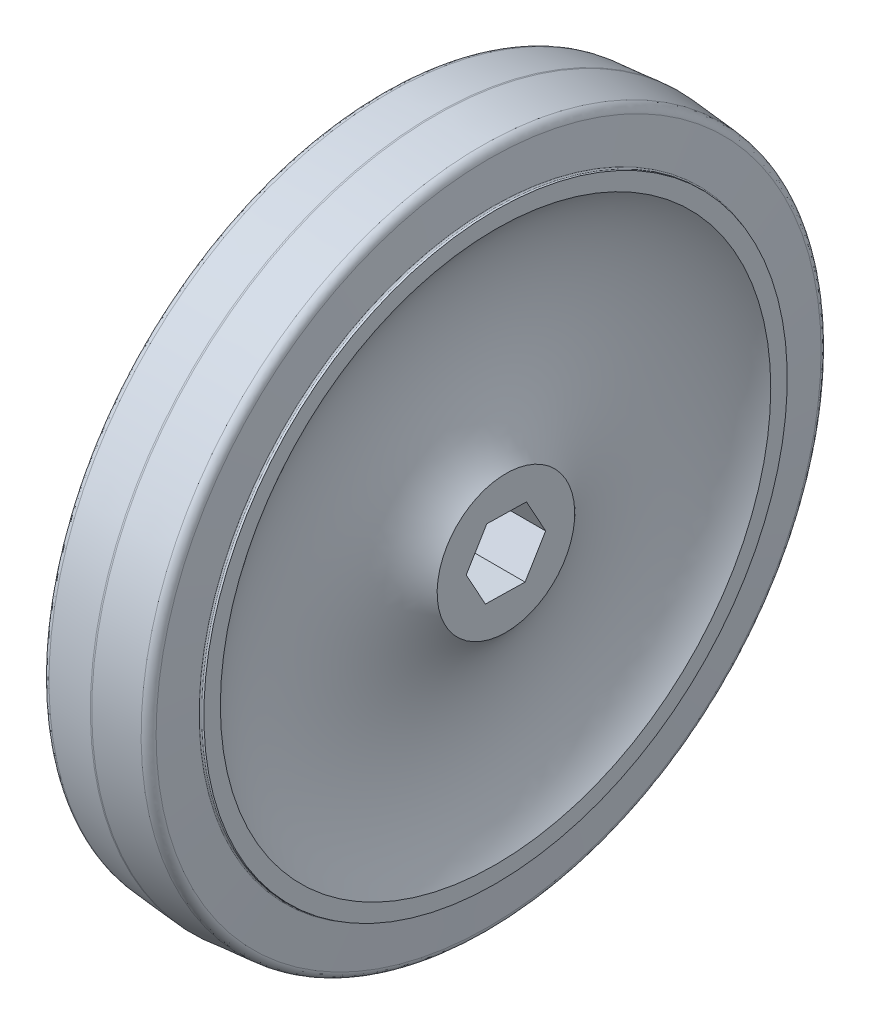
ISO-10303-21;
HEADER;
FILE_DESCRIPTION(('STEP AP214'),'2;1');
FILE_NAME('part.step','',(''),(''),'','','');
FILE_SCHEMA(('AUTOMOTIVE_DESIGN { 1 0 10303 214 1 1 1 1 }'));
ENDSEC;
DATA;
#1=APPLICATION_CONTEXT('core data for automotive mechanical design processes');
#2=APPLICATION_PROTOCOL_DEFINITION('international standard','automotive_design',2000,#1);
#3=PRODUCT_CONTEXT('',#1,'mechanical');
#4=PRODUCT('Part','Part','',(#3));
#5=PRODUCT_RELATED_PRODUCT_CATEGORY('part','',(#4));
#6=PRODUCT_DEFINITION_FORMATION('','',#4);
#7=PRODUCT_DEFINITION_CONTEXT('part definition',#1,'design');
#8=PRODUCT_DEFINITION('design','',#6,#7);
#9=PRODUCT_DEFINITION_SHAPE('','',#8);
#10=(LENGTH_UNIT() NAMED_UNIT(*) SI_UNIT(.MILLI.,.METRE.));
#11=(NAMED_UNIT(*) PLANE_ANGLE_UNIT() SI_UNIT($,.RADIAN.));
#12=(NAMED_UNIT(*) SI_UNIT($,.STERADIAN.) SOLID_ANGLE_UNIT());
#13=UNCERTAINTY_MEASURE_WITH_UNIT(LENGTH_MEASURE(1.E-05),#10,'distance_accuracy_value','');
#14=(GEOMETRIC_REPRESENTATION_CONTEXT(3) GLOBAL_UNCERTAINTY_ASSIGNED_CONTEXT((#13)) GLOBAL_UNIT_ASSIGNED_CONTEXT((#10,
#11,#12)) REPRESENTATION_CONTEXT('',''));
#15=CARTESIAN_POINT('',(0.,0.,0.));
#16=DIRECTION('',(0.,0.,1.));
#17=DIRECTION('',(1.,0.,0.));
#18=AXIS2_PLACEMENT_3D('',#15,#16,#17);
#19=CARTESIAN_POINT('',(-0.132825359699238,63.4883792812576,0.));
#20=CARTESIAN_POINT('',(-0.0446120823182119,63.4960969425147,0.));
#21=CARTESIAN_POINT('',(0.0446120792047547,63.4960969425148,0.));
#22=CARTESIAN_POINT('',(0.13282535658578,63.4883792812576,0.));
#23=B_SPLINE_CURVE_WITH_KNOTS('',3,(#19,#20,#21,#22),.UNSPECIFIED.,.F.,.F.,(4,4),(0.,1.),.UNSPECIFIED.);
#24=CARTESIAN_POINT('',(14.7071729773621,0.,0.));
#25=DIRECTION('',(-1.,0.,0.));
#26=AXIS1_PLACEMENT('',#24,#25);
#27=SURFACE_OF_REVOLUTION('',#23,#26);
#28=CARTESIAN_POINT('',(0.13282535658578,0.,0.));
#29=DIRECTION('',(-1.,0.,0.));
#30=DIRECTION('',(0.,-1.,0.));
#31=AXIS2_PLACEMENT_3D('',#28,#29,#30);
#32=CIRCLE('',#31,63.4883792812576);
#33=CARTESIAN_POINT('',(0.13282535658578,-63.4883792812576,0.));
#34=VERTEX_POINT('',#33);
#35=EDGE_CURVE('E11',#34,#34,#32,.T.);
#36=ORIENTED_EDGE('',*,*,#35,.T.);
#37=EDGE_LOOP('',(#36));
#38=FACE_BOUND('',#37,.T.);
#39=CARTESIAN_POINT('',(-0.132825359699237,0.,0.));
#40=DIRECTION('',(-1.,0.,0.));
#41=DIRECTION('',(0.,-1.,0.));
#42=AXIS2_PLACEMENT_3D('',#39,#40,#41);
#43=CIRCLE('',#42,63.4883792812576);
#44=CARTESIAN_POINT('',(-0.132825359699237,-63.4883792812576,0.));
#45=VERTEX_POINT('',#44);
#46=EDGE_CURVE('E142',#45,#45,#43,.T.);
#47=ORIENTED_EDGE('',*,*,#46,.F.);
#48=EDGE_LOOP('',(#47));
#49=FACE_BOUND('',#48,.T.);
#50=ADVANCED_FACE('F35',(#38,#49),#27,.F.);
#51=CARTESIAN_POINT('',(0.13282535658578,0.,0.));
#52=DIRECTION('',(-1.,0.,0.));
#53=DIRECTION('',(0.,-1.,0.));
#54=AXIS2_PLACEMENT_3D('',#51,#52,#53);
#55=CONICAL_SURFACE('',#54,63.4883792812576,0.0872664618439879);
#56=CARTESIAN_POINT('',(8.50507834059142,0.,0.));
#57=DIRECTION('',(-1.,0.,0.));
#58=DIRECTION('',(0.,-1.,0.));
#59=AXIS2_PLACEMENT_3D('',#56,#57,#58);
#60=CIRCLE('',#59,62.7559020633616);
#61=CARTESIAN_POINT('',(8.50507834059142,-62.7559020633616,0.));
#62=VERTEX_POINT('',#61);
#63=EDGE_CURVE('E43',#62,#62,#60,.T.);
#64=ORIENTED_EDGE('',*,*,#63,.T.);
#65=EDGE_LOOP('',(#64));
#66=FACE_BOUND('',#65,.T.);
#67=ORIENTED_EDGE('',*,*,#35,.F.);
#68=EDGE_LOOP('',(#67));
#69=FACE_BOUND('',#68,.T.);
#70=ADVANCED_FACE('F166',(#66,#69),#55,.T.);
#71=CARTESIAN_POINT('',(8.50507834059142,62.7559020633616,0.));
#72=CARTESIAN_POINT('',(9.15566540499435,62.6989830733215,0.));
#73=CARTESIAN_POINT('',(9.83353471358664,62.0211137702149,0.));
#74=CARTESIAN_POINT('',(9.89045370489419,61.3705266905014,0.));
#75=B_SPLINE_CURVE_WITH_KNOTS('',3,(#71,#72,#73,#74),.UNSPECIFIED.,.F.,.F.,(4,4),(0.,1.),.UNSPECIFIED.);
#76=CARTESIAN_POINT('',(14.7071729773621,0.,0.));
#77=DIRECTION('',(-1.,0.,0.));
#78=AXIS1_PLACEMENT('',#76,#77);
#79=SURFACE_OF_REVOLUTION('',#75,#78);
#80=CARTESIAN_POINT('',(9.89045370489419,0.,0.));
#81=DIRECTION('',(-1.,0.,0.));
#82=DIRECTION('',(0.,-1.,0.));
#83=AXIS2_PLACEMENT_3D('',#80,#81,#82);
#84=CIRCLE('',#83,61.3705266905014);
#85=CARTESIAN_POINT('',(9.89045370489419,-61.3705266905014,0.));
#86=VERTEX_POINT('',#85);
#87=EDGE_CURVE('E229',#86,#86,#84,.T.);
#88=ORIENTED_EDGE('',*,*,#87,.T.);
#89=EDGE_LOOP('',(#88));
#90=FACE_BOUND('',#89,.T.);
#91=ORIENTED_EDGE('',*,*,#63,.F.);
#92=EDGE_LOOP('',(#91));
#93=FACE_BOUND('',#92,.T.);
#94=ADVANCED_FACE('F162',(#90,#93),#79,.F.);
#95=CARTESIAN_POINT('',(9.89045370489419,0.,0.));
#96=DIRECTION('',(-1.,0.,0.));
#97=DIRECTION('',(0.,-1.,0.));
#98=AXIS2_PLACEMENT_3D('',#95,#96,#97);
#99=CONICAL_SURFACE('',#98,61.3705266905014,1.48352986441458);
#100=CARTESIAN_POINT('',(10.5283041744809,0.,0.));
#101=DIRECTION('',(-1.,0.,0.));
#102=DIRECTION('',(0.,-1.,0.));
#103=AXIS2_PLACEMENT_3D('',#100,#101,#102);
#104=CIRCLE('',#103,54.0798624433617);
#105=CARTESIAN_POINT('',(10.5283041744809,-54.0798624433617,0.));
#106=VERTEX_POINT('',#105);
#107=EDGE_CURVE('E226',#106,#106,#104,.T.);
#108=ORIENTED_EDGE('',*,*,#107,.T.);
#109=EDGE_LOOP('',(#108));
#110=FACE_BOUND('',#109,.T.);
#111=ORIENTED_EDGE('',*,*,#87,.F.);
#112=EDGE_LOOP('',(#111));
#113=FACE_BOUND('',#112,.T.);
#114=ADVANCED_FACE('F165',(#110,#113),#99,.T.);
#115=CARTESIAN_POINT('',(10.5283041744809,54.0798624433617,0.));
#116=CARTESIAN_POINT('',(10.5382747895317,53.965897829641,0.));
#117=CARTESIAN_POINT('',(10.6669376820576,53.8480000043777,0.));
#118=CARTESIAN_POINT('',(10.7813376347635,53.8480000037143,0.));
#119=B_SPLINE_CURVE_WITH_KNOTS('',3,(#115,#116,#117,#118),.UNSPECIFIED.,.F.,.F.,(4,4),(0.,1.),.UNSPECIFIED.);
#120=CARTESIAN_POINT('',(14.7071729773621,0.,0.));
#121=DIRECTION('',(-1.,0.,0.));
#122=AXIS1_PLACEMENT('',#120,#121);
#123=SURFACE_OF_REVOLUTION('',#119,#122);
#124=CARTESIAN_POINT('',(10.7813376347635,0.,0.));
#125=DIRECTION('',(-1.,0.,0.));
#126=DIRECTION('',(0.,-1.,0.));
#127=AXIS2_PLACEMENT_3D('',#124,#125,#126);
#128=CIRCLE('',#127,53.8480000037143);
#129=CARTESIAN_POINT('',(10.7813376347635,-53.8480000037143,0.));
#130=VERTEX_POINT('',#129);
#131=EDGE_CURVE('E223',#130,#130,#128,.T.);
#132=ORIENTED_EDGE('',*,*,#131,.T.);
#133=EDGE_LOOP('',(#132));
#134=FACE_BOUND('',#133,.T.);
#135=ORIENTED_EDGE('',*,*,#107,.F.);
#136=EDGE_LOOP('',(#135));
#137=FACE_BOUND('',#136,.T.);
#138=ADVANCED_FACE('F235',(#134,#137),#123,.F.);
#139=CARTESIAN_POINT('',(14.7071729773621,0.,0.));
#140=DIRECTION('',(-1.,0.,0.));
#141=DIRECTION('',(0.,-1.,0.));
#142=AXIS2_PLACEMENT_3D('',#139,#140,#141);
#143=CYLINDRICAL_SURFACE('',#142,53.8480000037143);
#144=CARTESIAN_POINT('',(11.176,0.,0.));
#145=DIRECTION('',(-1.,0.,0.));
#146=DIRECTION('',(0.,-1.,0.));
#147=AXIS2_PLACEMENT_3D('',#144,#145,#146);
#148=CIRCLE('',#147,53.8480000037143);
#149=CARTESIAN_POINT('',(11.176,-53.8480000037143,0.));
#150=VERTEX_POINT('',#149);
#151=EDGE_CURVE('E220',#150,#150,#148,.T.);
#152=ORIENTED_EDGE('',*,*,#151,.T.);
#153=EDGE_LOOP('',(#152));
#154=FACE_BOUND('',#153,.T.);
#155=ORIENTED_EDGE('',*,*,#131,.F.);
#156=EDGE_LOOP('',(#155));
#157=FACE_BOUND('',#156,.T.);
#158=ADVANCED_FACE('F240',(#154,#157),#143,.T.);
#159=CARTESIAN_POINT('',(11.176,53.8480000037143,0.));
#160=DIRECTION('',(1.,0.,0.));
#161=DIRECTION('',(0.,1.,0.));
#162=AXIS2_PLACEMENT_3D('',#159,#160,#161);
#163=PLANE('',#162);
#164=CARTESIAN_POINT('',(11.176,0.,0.));
#165=DIRECTION('',(-1.,0.,0.));
#166=DIRECTION('',(0.,-1.,0.));
#167=AXIS2_PLACEMENT_3D('',#164,#165,#166);
#168=CIRCLE('',#167,50.8000000192722);
#169=CARTESIAN_POINT('',(11.176,-50.8000000192722,0.));
#170=VERTEX_POINT('',#169);
#171=EDGE_CURVE('E217',#170,#170,#168,.T.);
#172=ORIENTED_EDGE('',*,*,#171,.T.);
#173=EDGE_LOOP('',(#172));
#174=FACE_BOUND('',#173,.T.);
#175=ORIENTED_EDGE('',*,*,#151,.F.);
#176=EDGE_LOOP('',(#175));
#177=FACE_BOUND('',#176,.T.);
#178=ADVANCED_FACE('F247',(#174,#177),#163,.T.);
#179=CARTESIAN_POINT('',(11.176,50.8000000192722,0.));
#180=CARTESIAN_POINT('',(3.18922562584248,40.9050490685499,0.));
#181=CARTESIAN_POINT('',(4.15371689584211,21.742970833734,0.));
#182=CARTESIAN_POINT('',(13.0937000100648,12.7000000129965,0.));
#183=B_SPLINE_CURVE_WITH_KNOTS('',3,(#179,#180,#181,#182),.UNSPECIFIED.,.F.,.F.,(4,4),(0.,1.),.UNSPECIFIED.);
#184=CARTESIAN_POINT('',(14.7071729773621,0.,0.));
#185=DIRECTION('',(-1.,0.,0.));
#186=AXIS1_PLACEMENT('',#184,#185);
#187=SURFACE_OF_REVOLUTION('',#183,#186);
#188=CARTESIAN_POINT('',(13.0937000100648,0.,0.));
#189=DIRECTION('',(-1.,0.,0.));
#190=DIRECTION('',(0.,-1.,0.));
#191=AXIS2_PLACEMENT_3D('',#188,#189,#190);
#192=CIRCLE('',#191,12.7000000129965);
#193=CARTESIAN_POINT('',(13.0937000100648,-12.7000000129965,0.));
#194=VERTEX_POINT('',#193);
#195=EDGE_CURVE('E214',#194,#194,#192,.T.);
#196=ORIENTED_EDGE('',*,*,#195,.T.);
#197=EDGE_LOOP('',(#196));
#198=FACE_BOUND('',#197,.T.);
#199=ORIENTED_EDGE('',*,*,#171,.F.);
#200=EDGE_LOOP('',(#199));
#201=FACE_BOUND('',#200,.T.);
#202=ADVANCED_FACE('F253',(#198,#201),#187,.F.);
#203=CARTESIAN_POINT('',(13.0937000100648,12.7000000129965,0.));
#204=DIRECTION('',(1.,0.,0.));
#205=DIRECTION('',(0.,1.,0.));
#206=AXIS2_PLACEMENT_3D('',#203,#204,#205);
#207=PLANE('',#206);
#208=ORIENTED_EDGE('',*,*,#195,.F.);
#209=EDGE_LOOP('',(#208));
#210=FACE_BOUND('',#209,.T.);
#211=DIRECTION('',(0.,0.855696357158721,-0.517478254949224));
#212=VECTOR('',#211,1.);
#213=CARTESIAN_POINT('',(13.0937000100648,-6.42311883458115,-3.53650643576145));
#214=LINE('',#213,#212);
#215=CARTESIAN_POINT('',(13.0937000100648,-6.42311883458115,-3.53650643576145));
#216=VERTEX_POINT('',#215);
#217=CARTESIAN_POINT('',(13.0937000100648,-0.148855003273995,-7.3308373001543));
#218=VERTEX_POINT('',#217);
#219=EDGE_CURVE('E58',#216,#218,#214,.T.);
#220=ORIENTED_EDGE('',*,*,#219,.F.);
#221=DIRECTION('',(0.,-0.0203011361127084,-0.999793910699867));
#222=VECTOR('',#221,1.);
#223=CARTESIAN_POINT('',(13.0937000100648,-6.27426383130716,3.79433086439285));
#224=LINE('',#223,#222);
#225=CARTESIAN_POINT('',(13.0937000100648,-6.27426383130716,3.79433086439285));
#226=VERTEX_POINT('',#225);
#227=EDGE_CURVE('E107',#226,#216,#224,.T.);
#228=ORIENTED_EDGE('',*,*,#227,.F.);
#229=DIRECTION('',(0.,-0.875997493271429,-0.482315655750642));
#230=VECTOR('',#229,1.);
#231=CARTESIAN_POINT('',(13.0937000100648,0.148855003273997,7.3308373001543));
#232=LINE('',#231,#230);
#233=CARTESIAN_POINT('',(13.0937000100648,0.148855003273997,7.3308373001543));
#234=VERTEX_POINT('',#233);
#235=EDGE_CURVE('E110',#234,#226,#232,.T.);
#236=ORIENTED_EDGE('',*,*,#235,.F.);
#237=DIRECTION('',(0.,-0.855696357158721,0.517478254949224));
#238=VECTOR('',#237,1.);
#239=CARTESIAN_POINT('',(13.0937000100648,6.42311883458116,3.53650643576146));
#240=LINE('',#239,#238);
#241=CARTESIAN_POINT('',(13.0937000100648,6.42311883458116,3.53650643576146));
#242=VERTEX_POINT('',#241);
#243=EDGE_CURVE('E126',#242,#234,#240,.T.);
#244=ORIENTED_EDGE('',*,*,#243,.F.);
#245=DIRECTION('',(0.,0.0203011361127083,0.999793910699867));
#246=VECTOR('',#245,1.);
#247=CARTESIAN_POINT('',(13.0937000100648,6.27426383130716,-3.79433086439284));
#248=LINE('',#247,#246);
#249=CARTESIAN_POINT('',(13.0937000100648,6.27426383130716,-3.79433086439284));
#250=VERTEX_POINT('',#249);
#251=EDGE_CURVE('E123',#250,#242,#248,.T.);
#252=ORIENTED_EDGE('',*,*,#251,.F.);
#253=DIRECTION('',(0.,0.875997493271429,0.482315655750643));
#254=VECTOR('',#253,1.);
#255=CARTESIAN_POINT('',(13.0937000100648,-0.148855003273995,-7.3308373001543));
#256=LINE('',#255,#254);
#257=EDGE_CURVE('E121',#218,#250,#256,.T.);
#258=ORIENTED_EDGE('',*,*,#257,.F.);
#259=EDGE_LOOP('',(#220,#228,#236,#244,#252,#258));
#260=FACE_BOUND('',#259,.T.);
#261=ADVANCED_FACE('F257',(#210,#260),#207,.T.);
#262=CARTESIAN_POINT('',(-13.0937000105097,7.68349999801838,0.));
#263=DIRECTION('',(-1.,0.,0.));
#264=DIRECTION('',(0.,-1.,0.));
#265=AXIS2_PLACEMENT_3D('',#262,#263,#264);
#266=PLANE('',#265);
#267=CARTESIAN_POINT('',(-13.0937000105097,0.,0.));
#268=DIRECTION('',(-1.,0.,0.));
#269=DIRECTION('',(0.,-1.,0.));
#270=AXIS2_PLACEMENT_3D('',#267,#268,#269);
#271=CIRCLE('',#270,12.7000000064977);
#272=CARTESIAN_POINT('',(-13.0937000105097,-12.7000000064977,0.));
#273=VERTEX_POINT('',#272);
#274=EDGE_CURVE('E208',#273,#273,#271,.T.);
#275=ORIENTED_EDGE('',*,*,#274,.T.);
#276=EDGE_LOOP('',(#275));
#277=FACE_BOUND('',#276,.T.);
#278=CARTESIAN_POINT('',(-13.0937000105097,0.,0.));
#279=DIRECTION('',(-1.,0.,0.));
#280=DIRECTION('',(0.,-1.,0.));
#281=AXIS2_PLACEMENT_3D('',#278,#279,#280);
#282=CIRCLE('',#281,7.68349999801838);
#283=CARTESIAN_POINT('',(-13.0937000105097,-7.68349999801838,0.));
#284=VERTEX_POINT('',#283);
#285=EDGE_CURVE('E211',#284,#284,#282,.T.);
#286=ORIENTED_EDGE('',*,*,#285,.F.);
#287=EDGE_LOOP('',(#286));
#288=FACE_BOUND('',#287,.T.);
#289=ADVANCED_FACE('F281',(#277,#288),#266,.T.);
#290=CARTESIAN_POINT('',(-13.0937000105097,12.7000000064977,0.));
#291=CARTESIAN_POINT('',(-4.15371689654952,21.7429708270576,0.));
#292=CARTESIAN_POINT('',(-3.18922562625921,40.9050490611849,0.));
#293=CARTESIAN_POINT('',(-11.176,50.8000000120021,0.));
#294=B_SPLINE_CURVE_WITH_KNOTS('',3,(#290,#291,#292,#293),.UNSPECIFIED.,.F.,.F.,(4,4),(0.,1.),.UNSPECIFIED.);
#295=CARTESIAN_POINT('',(14.7071729773621,0.,0.));
#296=DIRECTION('',(-1.,0.,0.));
#297=AXIS1_PLACEMENT('',#295,#296);
#298=SURFACE_OF_REVOLUTION('',#294,#297);
#299=CARTESIAN_POINT('',(-11.176,0.,0.));
#300=DIRECTION('',(-1.,0.,0.));
#301=DIRECTION('',(0.,-1.,0.));
#302=AXIS2_PLACEMENT_3D('',#299,#300,#301);
#303=CIRCLE('',#302,50.8000000120021);
#304=CARTESIAN_POINT('',(-11.176,-50.8000000120021,0.));
#305=VERTEX_POINT('',#304);
#306=EDGE_CURVE('E205',#305,#305,#303,.T.);
#307=ORIENTED_EDGE('',*,*,#306,.T.);
#308=EDGE_LOOP('',(#307));
#309=FACE_BOUND('',#308,.T.);
#310=ORIENTED_EDGE('',*,*,#274,.F.);
#311=EDGE_LOOP('',(#310));
#312=FACE_BOUND('',#311,.T.);
#313=ADVANCED_FACE('F277',(#309,#312),#298,.F.);
#314=CARTESIAN_POINT('',(-11.176,50.8000000120021,0.));
#315=DIRECTION('',(-1.,0.,0.));
#316=DIRECTION('',(0.,-1.,0.));
#317=AXIS2_PLACEMENT_3D('',#314,#315,#316);
#318=PLANE('',#317);
#319=CARTESIAN_POINT('',(-11.176,0.,0.));
#320=DIRECTION('',(-1.,0.,0.));
#321=DIRECTION('',(0.,-1.,0.));
#322=AXIS2_PLACEMENT_3D('',#319,#320,#321);
#323=CIRCLE('',#322,53.8480000037143);
#324=CARTESIAN_POINT('',(-11.176,-53.8480000037143,0.));
#325=VERTEX_POINT('',#324);
#326=EDGE_CURVE('E202',#325,#325,#323,.T.);
#327=ORIENTED_EDGE('',*,*,#326,.T.);
#328=EDGE_LOOP('',(#327));
#329=FACE_BOUND('',#328,.T.);
#330=ORIENTED_EDGE('',*,*,#306,.F.);
#331=EDGE_LOOP('',(#330));
#332=FACE_BOUND('',#331,.T.);
#333=ADVANCED_FACE('F280',(#329,#332),#318,.T.);
#334=CARTESIAN_POINT('',(14.7071729773621,0.,0.));
#335=DIRECTION('',(-1.,0.,0.));
#336=DIRECTION('',(0.,-1.,0.));
#337=AXIS2_PLACEMENT_3D('',#334,#335,#336);
#338=CYLINDRICAL_SURFACE('',#337,53.8480000037143);
#339=CARTESIAN_POINT('',(-10.7813376379424,0.,0.));
#340=DIRECTION('',(-1.,0.,0.));
#341=DIRECTION('',(0.,-1.,0.));
#342=AXIS2_PLACEMENT_3D('',#339,#340,#341);
#343=CIRCLE('',#342,53.8480000037143);
#344=CARTESIAN_POINT('',(-10.7813376379424,-53.8480000037143,0.));
#345=VERTEX_POINT('',#344);
#346=EDGE_CURVE('E199',#345,#345,#343,.T.);
#347=ORIENTED_EDGE('',*,*,#346,.T.);
#348=EDGE_LOOP('',(#347));
#349=FACE_BOUND('',#348,.T.);
#350=ORIENTED_EDGE('',*,*,#326,.F.);
#351=EDGE_LOOP('',(#350));
#352=FACE_BOUND('',#351,.T.);
#353=ADVANCED_FACE('F321',(#349,#352),#338,.T.);
#354=CARTESIAN_POINT('',(-10.7813376379424,53.8480000037143,0.));
#355=CARTESIAN_POINT('',(-10.6669376854671,53.8480000050336,0.));
#356=CARTESIAN_POINT('',(-10.5382747941248,53.9658978301241,0.));
#357=CARTESIAN_POINT('',(-10.5283041791161,54.0798624433611,0.));
#358=B_SPLINE_CURVE_WITH_KNOTS('',3,(#354,#355,#356,#357),.UNSPECIFIED.,.F.,.F.,(4,4),(0.,1.),.UNSPECIFIED.);
#359=CARTESIAN_POINT('',(14.7071729773621,0.,0.));
#360=DIRECTION('',(-1.,0.,0.));
#361=AXIS1_PLACEMENT('',#359,#360);
#362=SURFACE_OF_REVOLUTION('',#358,#361);
#363=CARTESIAN_POINT('',(-10.5283041791161,0.,0.));
#364=DIRECTION('',(-1.,0.,0.));
#365=DIRECTION('',(0.,-1.,0.));
#366=AXIS2_PLACEMENT_3D('',#363,#364,#365);
#367=CIRCLE('',#366,54.0798624433611);
#368=CARTESIAN_POINT('',(-10.5283041791161,-54.0798624433611,0.));
#369=VERTEX_POINT('',#368);
#370=EDGE_CURVE('E196',#369,#369,#367,.T.);
#371=ORIENTED_EDGE('',*,*,#370,.T.);
#372=EDGE_LOOP('',(#371));
#373=FACE_BOUND('',#372,.T.);
#374=ORIENTED_EDGE('',*,*,#346,.F.);
#375=EDGE_LOOP('',(#374));
#376=FACE_BOUND('',#375,.T.);
#377=ADVANCED_FACE('F318',(#373,#376),#362,.F.);
#378=CARTESIAN_POINT('',(-10.5283041791161,0.,0.));
#379=DIRECTION('',(1.,0.,0.));
#380=DIRECTION('',(0.,1.,0.));
#381=AXIS2_PLACEMENT_3D('',#378,#379,#380);
#382=CONICAL_SURFACE('',#381,54.0798624433611,1.48352986389232);
#383=CARTESIAN_POINT('',(-9.89045370645038,0.,0.));
#384=DIRECTION('',(-1.,0.,0.));
#385=DIRECTION('',(0.,-1.,0.));
#386=AXIS2_PLACEMENT_3D('',#383,#384,#385);
#387=CIRCLE('',#386,61.37052668184);
#388=CARTESIAN_POINT('',(-9.89045370645038,-61.37052668184,0.));
#389=VERTEX_POINT('',#388);
#390=EDGE_CURVE('E186',#389,#389,#387,.T.);
#391=ORIENTED_EDGE('',*,*,#390,.T.);
#392=EDGE_LOOP('',(#391));
#393=FACE_BOUND('',#392,.T.);
#394=ORIENTED_EDGE('',*,*,#370,.F.);
#395=EDGE_LOOP('',(#394));
#396=FACE_BOUND('',#395,.T.);
#397=ADVANCED_FACE('F314',(#393,#396),#382,.T.);
#398=CARTESIAN_POINT('',(-9.89045370645038,61.37052668184,0.));
#399=CARTESIAN_POINT('',(-9.83353471515451,62.0211137614172,0.));
#400=CARTESIAN_POINT('',(-9.15566540687137,62.698983064455,0.));
#401=CARTESIAN_POINT('',(-8.50507834255647,62.7559020546639,0.));
#402=B_SPLINE_CURVE_WITH_KNOTS('',3,(#398,#399,#400,#401),.UNSPECIFIED.,.F.,.F.,(4,4),(0.,1.),.UNSPECIFIED.);
#403=CARTESIAN_POINT('',(14.7071729773621,0.,0.));
#404=DIRECTION('',(-1.,0.,0.));
#405=AXIS1_PLACEMENT('',#403,#404);
#406=SURFACE_OF_REVOLUTION('',#402,#405);
#407=CARTESIAN_POINT('',(-8.50507834255647,0.,0.));
#408=DIRECTION('',(-1.,0.,0.));
#409=DIRECTION('',(0.,-1.,0.));
#410=AXIS2_PLACEMENT_3D('',#407,#408,#409);
#411=CIRCLE('',#410,62.7559020546639);
#412=CARTESIAN_POINT('',(-8.50507834255647,-62.7559020546639,0.));
#413=VERTEX_POINT('',#412);
#414=EDGE_CURVE('E183',#413,#413,#411,.T.);
#415=ORIENTED_EDGE('',*,*,#414,.T.);
#416=EDGE_LOOP('',(#415));
#417=FACE_BOUND('',#416,.T.);
#418=ORIENTED_EDGE('',*,*,#390,.F.);
#419=EDGE_LOOP('',(#418));
#420=FACE_BOUND('',#419,.T.);
#421=ADVANCED_FACE('F311',(#417,#420),#406,.F.);
#422=CARTESIAN_POINT('',(-8.50507834255647,0.,0.));
#423=DIRECTION('',(1.,0.,0.));
#424=DIRECTION('',(0.,1.,0.));
#425=AXIS2_PLACEMENT_3D('',#422,#423,#424);
#426=CONICAL_SURFACE('',#425,62.7559020546639,0.0872664628868776);
#427=ORIENTED_EDGE('',*,*,#46,.T.);
#428=EDGE_LOOP('',(#427));
#429=FACE_BOUND('',#428,.T.);
#430=ORIENTED_EDGE('',*,*,#414,.F.);
#431=EDGE_LOOP('',(#430));
#432=FACE_BOUND('',#431,.T.);
#433=ADVANCED_FACE('F297',(#429,#432),#426,.T.);
#434=CARTESIAN_POINT('',(-13.1000499899352,0.,0.));
#435=DIRECTION('',(1.,0.,0.));
#436=DIRECTION('',(0.,1.,0.));
#437=AXIS2_PLACEMENT_3D('',#434,#435,#436);
#438=CYLINDRICAL_SURFACE('',#437,7.68349999801838);
#439=ORIENTED_EDGE('',*,*,#285,.T.);
#440=EDGE_LOOP('',(#439));
#441=FACE_BOUND('',#440,.T.);
#442=CARTESIAN_POINT('',(-13.1000499899352,0.,0.));
#443=DIRECTION('',(1.,0.,0.));
#444=DIRECTION('',(0.,1.,0.));
#445=AXIS2_PLACEMENT_3D('',#442,#443,#444);
#446=CIRCLE('',#445,7.68349999801838);
#447=CARTESIAN_POINT('',(-13.1000499899352,7.68349999801838,0.));
#448=VERTEX_POINT('',#447);
#449=EDGE_CURVE('E133',#448,#448,#446,.T.);
#450=ORIENTED_EDGE('',*,*,#449,.T.);
#451=EDGE_LOOP('',(#450));
#452=FACE_BOUND('',#451,.T.);
#453=ADVANCED_FACE('F294',(#441,#452),#438,.T.);
#454=CARTESIAN_POINT('',(-13.1000499899352,0.,0.));
#455=DIRECTION('',(1.,0.,0.));
#456=DIRECTION('',(0.,1.,0.));
#457=AXIS2_PLACEMENT_3D('',#454,#455,#456);
#458=PLANE('',#457);
#459=DIRECTION('',(0.,-0.0203011361127084,-0.999793910699867));
#460=VECTOR('',#459,1.);
#461=CARTESIAN_POINT('',(-13.1000499899352,-6.27426383130716,3.79433086439285));
#462=LINE('',#461,#460);
#463=CARTESIAN_POINT('',(-13.1000499899352,-6.27426383130716,3.79433086439285));
#464=VERTEX_POINT('',#463);
#465=CARTESIAN_POINT('',(-13.1000499899352,-6.42311883458115,-3.53650643576145));
#466=VERTEX_POINT('',#465);
#467=EDGE_CURVE('E96',#464,#466,#462,.T.);
#468=ORIENTED_EDGE('',*,*,#467,.T.);
#469=DIRECTION('',(0.,0.855696357158721,-0.517478254949224));
#470=VECTOR('',#469,1.);
#471=CARTESIAN_POINT('',(-13.1000499899352,-6.42311883458115,-3.53650643576145));
#472=LINE('',#471,#470);
#473=CARTESIAN_POINT('',(-13.1000499899352,-0.148855003273995,-7.3308373001543));
#474=VERTEX_POINT('',#473);
#475=EDGE_CURVE('E90',#466,#474,#472,.T.);
#476=ORIENTED_EDGE('',*,*,#475,.T.);
#477=DIRECTION('',(0.,0.875997493271429,0.482315655750643));
#478=VECTOR('',#477,1.);
#479=CARTESIAN_POINT('',(-13.1000499899352,-0.148855003273995,-7.3308373001543));
#480=LINE('',#479,#478);
#481=CARTESIAN_POINT('',(-13.1000499899352,6.27426383130716,-3.79433086439284));
#482=VERTEX_POINT('',#481);
#483=EDGE_CURVE('E99',#474,#482,#480,.T.);
#484=ORIENTED_EDGE('',*,*,#483,.T.);
#485=DIRECTION('',(0.,0.0203011361127083,0.999793910699867));
#486=VECTOR('',#485,1.);
#487=CARTESIAN_POINT('',(-13.1000499899352,6.27426383130716,-3.79433086439284));
#488=LINE('',#487,#486);
#489=CARTESIAN_POINT('',(-13.1000499899352,6.42311883458116,3.53650643576146));
#490=VERTEX_POINT('',#489);
#491=EDGE_CURVE('E50',#482,#490,#488,.T.);
#492=ORIENTED_EDGE('',*,*,#491,.T.);
#493=DIRECTION('',(0.,-0.855696357158721,0.517478254949224));
#494=VECTOR('',#493,1.);
#495=CARTESIAN_POINT('',(-13.1000499899352,6.42311883458116,3.53650643576146));
#496=LINE('',#495,#494);
#497=CARTESIAN_POINT('',(-13.1000499899352,0.148855003273997,7.3308373001543));
#498=VERTEX_POINT('',#497);
#499=EDGE_CURVE('E114',#490,#498,#496,.T.);
#500=ORIENTED_EDGE('',*,*,#499,.T.);
#501=DIRECTION('',(0.,-0.875997493271429,-0.482315655750642));
#502=VECTOR('',#501,1.);
#503=CARTESIAN_POINT('',(-13.1000499899352,0.148855003273997,7.3308373001543));
#504=LINE('',#503,#502);
#505=EDGE_CURVE('E117',#498,#464,#504,.T.);
#506=ORIENTED_EDGE('',*,*,#505,.T.);
#507=EDGE_LOOP('',(#468,#476,#484,#492,#500,#506));
#508=FACE_BOUND('',#507,.T.);
#509=ORIENTED_EDGE('',*,*,#449,.F.);
#510=EDGE_LOOP('',(#509));
#511=FACE_BOUND('',#510,.T.);
#512=ADVANCED_FACE('F103',(#508,#511),#458,.F.);
#513=CARTESIAN_POINT('',(-13.1000499899352,-6.42311883458115,-3.53650643576145));
#514=DIRECTION('',(0.,-0.517478254949224,-0.855696357158721));
#515=DIRECTION('',(0.,0.855696357158721,-0.517478254949224));
#516=AXIS2_PLACEMENT_3D('',#513,#514,#515);
#517=PLANE('',#516);
#518=ORIENTED_EDGE('',*,*,#219,.T.);
#519=DIRECTION('',(1.,0.,0.));
#520=VECTOR('',#519,1.);
#521=CARTESIAN_POINT('',(-13.1000499899352,-0.148855003273995,-7.3308373001543));
#522=LINE('',#521,#520);
#523=EDGE_CURVE('E86',#474,#218,#522,.T.);
#524=ORIENTED_EDGE('',*,*,#523,.F.);
#525=ORIENTED_EDGE('',*,*,#475,.F.);
#526=DIRECTION('',(1.,0.,0.));
#527=VECTOR('',#526,1.);
#528=CARTESIAN_POINT('',(-13.1000499899352,-6.42311883458115,-3.53650643576145));
#529=LINE('',#528,#527);
#530=EDGE_CURVE('E131',#466,#216,#529,.T.);
#531=ORIENTED_EDGE('',*,*,#530,.T.);
#532=EDGE_LOOP('',(#518,#524,#525,#531));
#533=FACE_BOUND('',#532,.T.);
#534=ADVANCED_FACE('F88',(#533),#517,.F.);
#535=CARTESIAN_POINT('',(-13.1000499899352,-6.27426383130716,3.79433086439285));
#536=DIRECTION('',(0.,-0.999793910699867,0.0203011361127084));
#537=DIRECTION('',(0.,-0.0203011361127084,-0.999793910699867));
#538=AXIS2_PLACEMENT_3D('',#535,#536,#537);
#539=PLANE('',#538);
#540=ORIENTED_EDGE('',*,*,#227,.T.);
#541=ORIENTED_EDGE('',*,*,#530,.F.);
#542=ORIENTED_EDGE('',*,*,#467,.F.);
#543=DIRECTION('',(1.,0.,0.));
#544=VECTOR('',#543,1.);
#545=CARTESIAN_POINT('',(-13.1000499899352,-6.27426383130716,3.79433086439285));
#546=LINE('',#545,#544);
#547=EDGE_CURVE('E134',#464,#226,#546,.T.);
#548=ORIENTED_EDGE('',*,*,#547,.T.);
#549=EDGE_LOOP('',(#540,#541,#542,#548));
#550=FACE_BOUND('',#549,.T.);
#551=ADVANCED_FACE('F305',(#550),#539,.F.);
#552=CARTESIAN_POINT('',(-13.1000499899352,0.148855003273997,7.3308373001543));
#553=DIRECTION('',(0.,-0.482315655750642,0.875997493271429));
#554=DIRECTION('',(0.,-0.875997493271429,-0.482315655750642));
#555=AXIS2_PLACEMENT_3D('',#552,#553,#554);
#556=PLANE('',#555);
#557=ORIENTED_EDGE('',*,*,#235,.T.);
#558=ORIENTED_EDGE('',*,*,#547,.F.);
#559=ORIENTED_EDGE('',*,*,#505,.F.);
#560=DIRECTION('',(1.,0.,0.));
#561=VECTOR('',#560,1.);
#562=CARTESIAN_POINT('',(-13.1000499899352,0.148855003273997,7.3308373001543));
#563=LINE('',#562,#561);
#564=EDGE_CURVE('E136',#498,#234,#563,.T.);
#565=ORIENTED_EDGE('',*,*,#564,.T.);
#566=EDGE_LOOP('',(#557,#558,#559,#565));
#567=FACE_BOUND('',#566,.T.);
#568=ADVANCED_FACE('F420',(#567),#556,.F.);
#569=CARTESIAN_POINT('',(-13.1000499899352,6.42311883458116,3.53650643576146));
#570=DIRECTION('',(0.,0.517478254949224,0.855696357158721));
#571=DIRECTION('',(0.,-0.855696357158721,0.517478254949224));
#572=AXIS2_PLACEMENT_3D('',#569,#570,#571);
#573=PLANE('',#572);
#574=ORIENTED_EDGE('',*,*,#243,.T.);
#575=ORIENTED_EDGE('',*,*,#564,.F.);
#576=ORIENTED_EDGE('',*,*,#499,.F.);
#577=DIRECTION('',(1.,0.,0.));
#578=VECTOR('',#577,1.);
#579=CARTESIAN_POINT('',(-13.1000499899352,6.42311883458116,3.53650643576146));
#580=LINE('',#579,#578);
#581=EDGE_CURVE('E138',#490,#242,#580,.T.);
#582=ORIENTED_EDGE('',*,*,#581,.T.);
#583=EDGE_LOOP('',(#574,#575,#576,#582));
#584=FACE_BOUND('',#583,.T.);
#585=ADVANCED_FACE('F430',(#584),#573,.F.);
#586=CARTESIAN_POINT('',(-13.1000499899352,6.27426383130716,-3.79433086439284));
#587=DIRECTION('',(0.,0.999793910699867,-0.0203011361127083));
#588=DIRECTION('',(0.,0.0203011361127083,0.999793910699867));
#589=AXIS2_PLACEMENT_3D('',#586,#587,#588);
#590=PLANE('',#589);
#591=ORIENTED_EDGE('',*,*,#251,.T.);
#592=ORIENTED_EDGE('',*,*,#581,.F.);
#593=ORIENTED_EDGE('',*,*,#491,.F.);
#594=DIRECTION('',(1.,0.,0.));
#595=VECTOR('',#594,1.);
#596=CARTESIAN_POINT('',(-13.1000499899352,6.27426383130716,-3.79433086439284));
#597=LINE('',#596,#595);
#598=EDGE_CURVE('E95',#482,#250,#597,.T.);
#599=ORIENTED_EDGE('',*,*,#598,.T.);
#600=EDGE_LOOP('',(#591,#592,#593,#599));
#601=FACE_BOUND('',#600,.T.);
#602=ADVANCED_FACE('F440',(#601),#590,.F.);
#603=CARTESIAN_POINT('',(-13.1000499899352,-0.148855003273995,-7.3308373001543));
#604=DIRECTION('',(0.,0.482315655750643,-0.875997493271429));
#605=DIRECTION('',(0.,0.875997493271429,0.482315655750643));
#606=AXIS2_PLACEMENT_3D('',#603,#604,#605);
#607=PLANE('',#606);
#608=ORIENTED_EDGE('',*,*,#257,.T.);
#609=ORIENTED_EDGE('',*,*,#598,.F.);
#610=ORIENTED_EDGE('',*,*,#483,.F.);
#611=ORIENTED_EDGE('',*,*,#523,.T.);
#612=EDGE_LOOP('',(#608,#609,#610,#611));
#613=FACE_BOUND('',#612,.T.);
#614=ADVANCED_FACE('F100',(#613),#607,.F.);
#615=CLOSED_SHELL('',(#50,#70,#94,#114,#138,#158,#178,#202,#261,#289,#313,#333,#353,#377,#397,
#421,#433,#453,#512,#534,#551,#568,#585,#602,#614));
#616=MANIFOLD_SOLID_BREP('B2',#615);
#617=ADVANCED_BREP_SHAPE_REPRESENTATION('',(#18,#616),#14);
#618=SHAPE_DEFINITION_REPRESENTATION(#9,#617);
ENDSEC;
END-ISO-10303-21;
